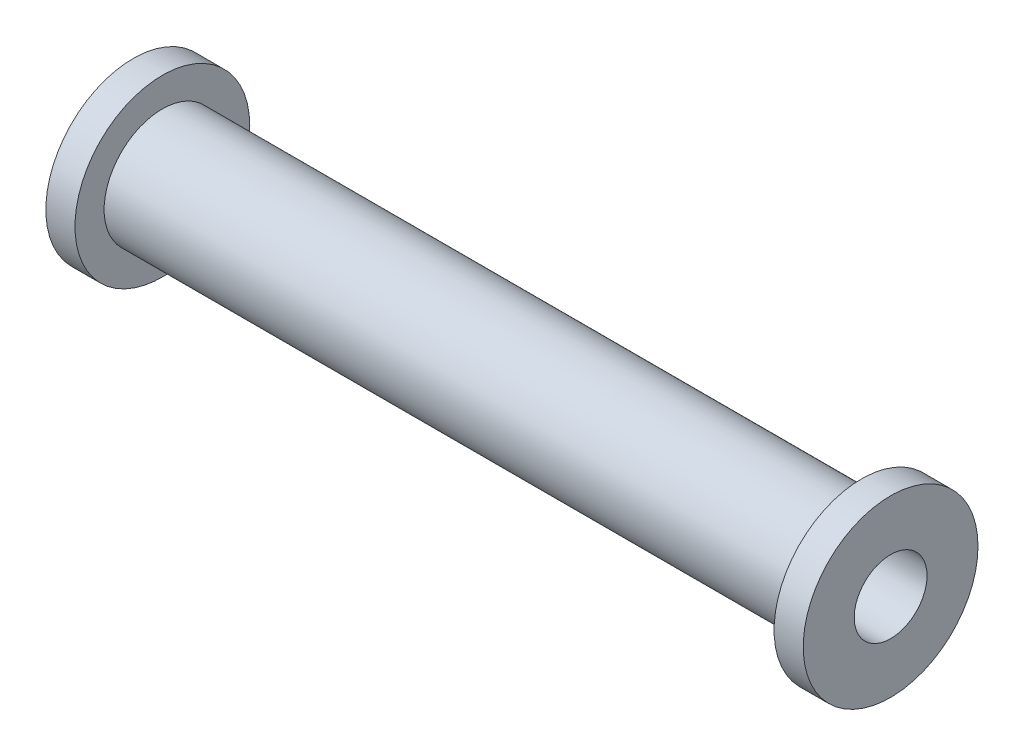
ISO-10303-21;
HEADER;
FILE_DESCRIPTION(('STEP AP214'),'2;1');
FILE_NAME('part.step','',(''),(''),'','','');
FILE_SCHEMA(('AUTOMOTIVE_DESIGN { 1 0 10303 214 1 1 1 1 }'));
ENDSEC;
DATA;
#1=APPLICATION_CONTEXT('core data for automotive mechanical design processes');
#2=APPLICATION_PROTOCOL_DEFINITION('international standard','automotive_design',2000,#1);
#3=PRODUCT_CONTEXT('',#1,'mechanical');
#4=PRODUCT('Part','Part','',(#3));
#5=PRODUCT_RELATED_PRODUCT_CATEGORY('part','',(#4));
#6=PRODUCT_DEFINITION_FORMATION('','',#4);
#7=PRODUCT_DEFINITION_CONTEXT('part definition',#1,'design');
#8=PRODUCT_DEFINITION('design','',#6,#7);
#9=PRODUCT_DEFINITION_SHAPE('','',#8);
#10=(LENGTH_UNIT() NAMED_UNIT(*) SI_UNIT(.MILLI.,.METRE.));
#11=(NAMED_UNIT(*) PLANE_ANGLE_UNIT() SI_UNIT($,.RADIAN.));
#12=(NAMED_UNIT(*) SI_UNIT($,.STERADIAN.) SOLID_ANGLE_UNIT());
#13=UNCERTAINTY_MEASURE_WITH_UNIT(LENGTH_MEASURE(1.E-05),#10,'distance_accuracy_value','');
#14=(GEOMETRIC_REPRESENTATION_CONTEXT(3) GLOBAL_UNCERTAINTY_ASSIGNED_CONTEXT((#13)) GLOBAL_UNIT_ASSIGNED_CONTEXT((#10,
#11,#12)) REPRESENTATION_CONTEXT('',''));
#15=CARTESIAN_POINT('',(0.,0.,0.));
#16=DIRECTION('',(0.,0.,1.));
#17=DIRECTION('',(1.,0.,0.));
#18=AXIS2_PLACEMENT_3D('',#15,#16,#17);
#19=CARTESIAN_POINT('',(1.,0.,0.));
#20=DIRECTION('',(1.,0.,0.));
#21=DIRECTION('',(0.,0.,-1.));
#22=AXIS2_PLACEMENT_3D('',#19,#20,#21);
#23=PLANE('',#22);
#24=CARTESIAN_POINT('',(1.,0.,0.));
#25=DIRECTION('',(1.,0.,0.));
#26=DIRECTION('',(0.,0.,-1.));
#27=AXIS2_PLACEMENT_3D('',#24,#25,#26);
#28=CIRCLE('',#27,3.);
#29=CARTESIAN_POINT('',(1.,0.,-3.));
#30=VERTEX_POINT('',#29);
#31=EDGE_CURVE('E10',#30,#30,#28,.T.);
#32=ORIENTED_EDGE('',*,*,#31,.T.);
#33=EDGE_LOOP('',(#32));
#34=FACE_BOUND('',#33,.T.);
#35=CARTESIAN_POINT('',(1.,0.,0.));
#36=DIRECTION('',(1.,0.,0.));
#37=DIRECTION('',(0.,0.,-1.));
#38=AXIS2_PLACEMENT_3D('',#35,#36,#37);
#39=CIRCLE('',#38,2.);
#40=CARTESIAN_POINT('',(1.,0.,-2.));
#41=VERTEX_POINT('',#40);
#42=EDGE_CURVE('E60',#41,#41,#39,.T.);
#43=ORIENTED_EDGE('',*,*,#42,.F.);
#44=EDGE_LOOP('',(#43));
#45=FACE_BOUND('',#44,.T.);
#46=ADVANCED_FACE('F41',(#34,#45),#23,.T.);
#47=CARTESIAN_POINT('',(0.,0.,0.));
#48=DIRECTION('',(1.,0.,0.));
#49=DIRECTION('',(0.,0.,-1.));
#50=AXIS2_PLACEMENT_3D('',#47,#48,#49);
#51=PLANE('',#50);
#52=CARTESIAN_POINT('',(0.,0.,0.));
#53=DIRECTION('',(1.,0.,0.));
#54=DIRECTION('',(0.,0.,-1.));
#55=AXIS2_PLACEMENT_3D('',#52,#53,#54);
#56=CIRCLE('',#55,3.);
#57=CARTESIAN_POINT('',(0.,0.,-3.));
#58=VERTEX_POINT('',#57);
#59=EDGE_CURVE('E45',#58,#58,#56,.T.);
#60=ORIENTED_EDGE('',*,*,#59,.F.);
#61=EDGE_LOOP('',(#60));
#62=FACE_BOUND('',#61,.T.);
#63=CARTESIAN_POINT('',(0.,0.,0.));
#64=DIRECTION('',(1.,0.,0.));
#65=DIRECTION('',(0.,0.,-1.));
#66=AXIS2_PLACEMENT_3D('',#63,#64,#65);
#67=CIRCLE('',#66,1.25);
#68=CARTESIAN_POINT('',(0.,0.,-1.25));
#69=VERTEX_POINT('',#68);
#70=EDGE_CURVE('E54',#69,#69,#67,.T.);
#71=ORIENTED_EDGE('',*,*,#70,.T.);
#72=EDGE_LOOP('',(#71));
#73=FACE_BOUND('',#72,.T.);
#74=ADVANCED_FACE('F98',(#62,#73),#51,.F.);
#75=CARTESIAN_POINT('',(1.,0.,0.));
#76=DIRECTION('',(-1.,0.,0.));
#77=DIRECTION('',(0.,0.,1.));
#78=AXIS2_PLACEMENT_3D('',#75,#76,#77);
#79=CYLINDRICAL_SURFACE('',#78,3.);
#80=ORIENTED_EDGE('',*,*,#31,.F.);
#81=EDGE_LOOP('',(#80));
#82=FACE_BOUND('',#81,.T.);
#83=ORIENTED_EDGE('',*,*,#59,.T.);
#84=EDGE_LOOP('',(#83));
#85=FACE_BOUND('',#84,.T.);
#86=ADVANCED_FACE('F43',(#82,#85),#79,.T.);
#87=CARTESIAN_POINT('',(1.,0.,0.));
#88=DIRECTION('',(-1.,0.,0.));
#89=DIRECTION('',(0.,0.,1.));
#90=AXIS2_PLACEMENT_3D('',#87,#88,#89);
#91=CYLINDRICAL_SURFACE('',#90,1.25);
#92=ORIENTED_EDGE('',*,*,#70,.F.);
#93=EDGE_LOOP('',(#92));
#94=FACE_BOUND('',#93,.T.);
#95=CARTESIAN_POINT('',(26.,0.,0.));
#96=DIRECTION('',(1.,0.,0.));
#97=DIRECTION('',(0.,0.,-1.));
#98=AXIS2_PLACEMENT_3D('',#95,#96,#97);
#99=CIRCLE('',#98,1.25);
#100=CARTESIAN_POINT('',(26.,0.,-1.25));
#101=VERTEX_POINT('',#100);
#102=EDGE_CURVE('E72',#101,#101,#99,.T.);
#103=ORIENTED_EDGE('',*,*,#102,.T.);
#104=EDGE_LOOP('',(#103));
#105=FACE_BOUND('',#104,.T.);
#106=ADVANCED_FACE('F80',(#94,#105),#91,.F.);
#107=CARTESIAN_POINT('',(25.,0.,0.));
#108=DIRECTION('',(-1.,0.,0.));
#109=DIRECTION('',(0.,0.,1.));
#110=AXIS2_PLACEMENT_3D('',#107,#108,#109);
#111=CYLINDRICAL_SURFACE('',#110,2.);
#112=CARTESIAN_POINT('',(25.,0.,0.));
#113=DIRECTION('',(1.,0.,0.));
#114=DIRECTION('',(0.,0.,-1.));
#115=AXIS2_PLACEMENT_3D('',#112,#113,#114);
#116=CIRCLE('',#115,2.);
#117=CARTESIAN_POINT('',(25.,0.,-2.));
#118=VERTEX_POINT('',#117);
#119=EDGE_CURVE('E59',#118,#118,#116,.T.);
#120=ORIENTED_EDGE('',*,*,#119,.F.);
#121=EDGE_LOOP('',(#120));
#122=FACE_BOUND('',#121,.T.);
#123=ORIENTED_EDGE('',*,*,#42,.T.);
#124=EDGE_LOOP('',(#123));
#125=FACE_BOUND('',#124,.T.);
#126=ADVANCED_FACE('F85',(#122,#125),#111,.T.);
#127=CARTESIAN_POINT('',(26.,0.,0.));
#128=DIRECTION('',(1.,0.,0.));
#129=DIRECTION('',(0.,0.,-1.));
#130=AXIS2_PLACEMENT_3D('',#127,#128,#129);
#131=PLANE('',#130);
#132=CARTESIAN_POINT('',(26.,0.,0.));
#133=DIRECTION('',(1.,0.,0.));
#134=DIRECTION('',(0.,0.,-1.));
#135=AXIS2_PLACEMENT_3D('',#132,#133,#134);
#136=CIRCLE('',#135,3.);
#137=CARTESIAN_POINT('',(26.,0.,-3.));
#138=VERTEX_POINT('',#137);
#139=EDGE_CURVE('E64',#138,#138,#136,.T.);
#140=ORIENTED_EDGE('',*,*,#139,.T.);
#141=EDGE_LOOP('',(#140));
#142=FACE_BOUND('',#141,.T.);
#143=ORIENTED_EDGE('',*,*,#102,.F.);
#144=EDGE_LOOP('',(#143));
#145=FACE_BOUND('',#144,.T.);
#146=ADVANCED_FACE('F82',(#142,#145),#131,.T.);
#147=CARTESIAN_POINT('',(25.,0.,0.));
#148=DIRECTION('',(1.,0.,0.));
#149=DIRECTION('',(0.,0.,-1.));
#150=AXIS2_PLACEMENT_3D('',#147,#148,#149);
#151=PLANE('',#150);
#152=ORIENTED_EDGE('',*,*,#119,.T.);
#153=EDGE_LOOP('',(#152));
#154=FACE_BOUND('',#153,.T.);
#155=CARTESIAN_POINT('',(25.,0.,0.));
#156=DIRECTION('',(1.,0.,0.));
#157=DIRECTION('',(0.,0.,-1.));
#158=AXIS2_PLACEMENT_3D('',#155,#156,#157);
#159=CIRCLE('',#158,3.);
#160=CARTESIAN_POINT('',(25.,0.,-3.));
#161=VERTEX_POINT('',#160);
#162=EDGE_CURVE('E68',#161,#161,#159,.T.);
#163=ORIENTED_EDGE('',*,*,#162,.F.);
#164=EDGE_LOOP('',(#163));
#165=FACE_BOUND('',#164,.T.);
#166=ADVANCED_FACE('F84',(#154,#165),#151,.F.);
#167=CARTESIAN_POINT('',(26.,0.,0.));
#168=DIRECTION('',(-1.,0.,0.));
#169=DIRECTION('',(0.,0.,1.));
#170=AXIS2_PLACEMENT_3D('',#167,#168,#169);
#171=CYLINDRICAL_SURFACE('',#170,3.);
#172=ORIENTED_EDGE('',*,*,#139,.F.);
#173=EDGE_LOOP('',(#172));
#174=FACE_BOUND('',#173,.T.);
#175=ORIENTED_EDGE('',*,*,#162,.T.);
#176=EDGE_LOOP('',(#175));
#177=FACE_BOUND('',#176,.T.);
#178=ADVANCED_FACE('F92',(#174,#177),#171,.T.);
#179=CLOSED_SHELL('',(#46,#74,#86,#106,#126,#146,#166,#178));
#180=MANIFOLD_SOLID_BREP('B2',#179);
#181=ADVANCED_BREP_SHAPE_REPRESENTATION('',(#18,#180),#14);
#182=SHAPE_DEFINITION_REPRESENTATION(#9,#181);
ENDSEC;
END-ISO-10303-21;
